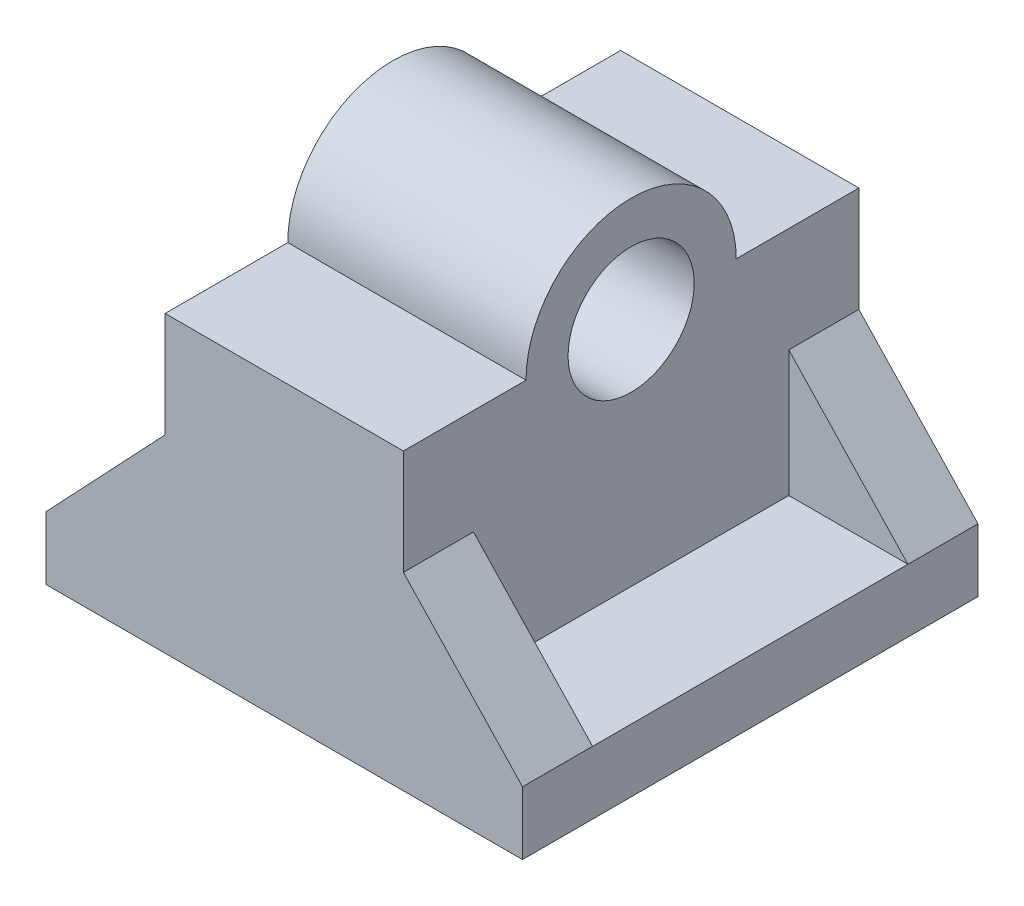
ISO-10303-21;
HEADER;
FILE_DESCRIPTION(('STEP AP214'),'2;1');
FILE_NAME('part.step','',(''),(''),'','','');
FILE_SCHEMA(('AUTOMOTIVE_DESIGN { 1 0 10303 214 1 1 1 1 }'));
ENDSEC;
DATA;
#1=APPLICATION_CONTEXT('core data for automotive mechanical design processes');
#2=APPLICATION_PROTOCOL_DEFINITION('international standard','automotive_design',2000,#1);
#3=PRODUCT_CONTEXT('',#1,'mechanical');
#4=PRODUCT('Part','Part','',(#3));
#5=PRODUCT_RELATED_PRODUCT_CATEGORY('part','',(#4));
#6=PRODUCT_DEFINITION_FORMATION('','',#4);
#7=PRODUCT_DEFINITION_CONTEXT('part definition',#1,'design');
#8=PRODUCT_DEFINITION('design','',#6,#7);
#9=PRODUCT_DEFINITION_SHAPE('','',#8);
#10=(LENGTH_UNIT() NAMED_UNIT(*) SI_UNIT(.MILLI.,.METRE.));
#11=(NAMED_UNIT(*) PLANE_ANGLE_UNIT() SI_UNIT($,.RADIAN.));
#12=(NAMED_UNIT(*) SI_UNIT($,.STERADIAN.) SOLID_ANGLE_UNIT());
#13=UNCERTAINTY_MEASURE_WITH_UNIT(LENGTH_MEASURE(1.E-05),#10,'distance_accuracy_value','');
#14=(GEOMETRIC_REPRESENTATION_CONTEXT(3) GLOBAL_UNCERTAINTY_ASSIGNED_CONTEXT((#13)) GLOBAL_UNIT_ASSIGNED_CONTEXT((#10,
#11,#12)) REPRESENTATION_CONTEXT('',''));
#15=CARTESIAN_POINT('',(0.,0.,0.));
#16=DIRECTION('',(0.,0.,1.));
#17=DIRECTION('',(1.,0.,0.));
#18=AXIS2_PLACEMENT_3D('',#15,#16,#17);
#19=CARTESIAN_POINT('',(34.,9.00000000000001,-65.));
#20=DIRECTION('',(0.727013152549817,0.686623532963716,0.));
#21=DIRECTION('',(-0.686623532963717,0.727013152549817,0.));
#22=AXIS2_PLACEMENT_3D('',#19,#20,#21);
#23=PLANE('',#22);
#24=DIRECTION('',(0.686623532963717,-0.727013152549817,0.));
#25=VECTOR('',#24,1.);
#26=CARTESIAN_POINT('',(34.,9.00000000000001,-10.));
#27=LINE('',#26,#25);
#28=CARTESIAN_POINT('',(17.,27.,-10.));
#29=VERTEX_POINT('',#28);
#30=CARTESIAN_POINT('',(34.,9.00000000000001,-10.));
#31=VERTEX_POINT('',#30);
#32=EDGE_CURVE('E11',#29,#31,#27,.T.);
#33=ORIENTED_EDGE('',*,*,#32,.F.);
#34=DIRECTION('',(0.,0.,1.));
#35=VECTOR('',#34,1.);
#36=CARTESIAN_POINT('',(17.,27.,-65.));
#37=LINE('',#36,#35);
#38=CARTESIAN_POINT('',(17.,27.,0.));
#39=VERTEX_POINT('',#38);
#40=EDGE_CURVE('E174',#29,#39,#37,.T.);
#41=ORIENTED_EDGE('',*,*,#40,.T.);
#42=DIRECTION('',(-0.686623532963716,0.727013152549817,0.));
#43=VECTOR('',#42,1.);
#44=CARTESIAN_POINT('',(34.,9.00000000000001,0.));
#45=LINE('',#44,#43);
#46=CARTESIAN_POINT('',(34.,9.00000000000001,0.));
#47=VERTEX_POINT('',#46);
#48=EDGE_CURVE('E244',#47,#39,#45,.T.);
#49=ORIENTED_EDGE('',*,*,#48,.F.);
#50=DIRECTION('',(0.,0.,1.));
#51=VECTOR('',#50,1.);
#52=CARTESIAN_POINT('',(34.,9.00000000000001,-65.));
#53=LINE('',#52,#51);
#54=EDGE_CURVE('E284',#31,#47,#53,.T.);
#55=ORIENTED_EDGE('',*,*,#54,.F.);
#56=EDGE_LOOP('',(#33,#41,#49,#55));
#57=FACE_BOUND('',#56,.T.);
#58=ADVANCED_FACE('F43',(#57),#23,.T.);
#59=CARTESIAN_POINT('',(-34.,9.00000000000001,-65.));
#60=DIRECTION('',(-0.727013152549817,0.686623532963716,0.));
#61=DIRECTION('',(-0.686623532963717,-0.727013152549817,0.));
#62=AXIS2_PLACEMENT_3D('',#59,#60,#61);
#63=PLANE('',#62);
#64=DIRECTION('',(0.,0.,1.));
#65=VECTOR('',#64,1.);
#66=CARTESIAN_POINT('',(-34.,9.00000000000001,-65.));
#67=LINE('',#66,#65);
#68=CARTESIAN_POINT('',(-34.,9.00000000000001,-65.));
#69=VERTEX_POINT('',#68);
#70=CARTESIAN_POINT('',(-34.,9.00000000000001,-55.));
#71=VERTEX_POINT('',#70);
#72=EDGE_CURVE('E264',#69,#71,#67,.T.);
#73=ORIENTED_EDGE('',*,*,#72,.T.);
#74=DIRECTION('',(0.686623532963717,0.727013152549817,0.));
#75=VECTOR('',#74,1.);
#76=CARTESIAN_POINT('',(-34.,9.00000000000001,-55.));
#77=LINE('',#76,#75);
#78=CARTESIAN_POINT('',(-17.,27.,-55.));
#79=VERTEX_POINT('',#78);
#80=EDGE_CURVE('E288',#71,#79,#77,.T.);
#81=ORIENTED_EDGE('',*,*,#80,.T.);
#82=DIRECTION('',(0.,0.,1.));
#83=VECTOR('',#82,1.);
#84=CARTESIAN_POINT('',(-17.,27.,-65.));
#85=LINE('',#84,#83);
#86=CARTESIAN_POINT('',(-17.,27.,-65.));
#87=VERTEX_POINT('',#86);
#88=EDGE_CURVE('E268',#87,#79,#85,.T.);
#89=ORIENTED_EDGE('',*,*,#88,.F.);
#90=DIRECTION('',(-0.686623532963716,-0.727013152549817,0.));
#91=VECTOR('',#90,1.);
#92=CARTESIAN_POINT('',(-34.,9.00000000000001,-65.));
#93=LINE('',#92,#91);
#94=EDGE_CURVE('E232',#87,#69,#93,.T.);
#95=ORIENTED_EDGE('',*,*,#94,.T.);
#96=EDGE_LOOP('',(#73,#81,#89,#95));
#97=FACE_BOUND('',#96,.T.);
#98=ADVANCED_FACE('F316',(#97),#63,.T.);
#99=CARTESIAN_POINT('',(-17.,27.,-10.));
#100=VERTEX_POINT('',#99);
#101=CARTESIAN_POINT('',(-17.,27.,0.));
#102=VERTEX_POINT('',#101);
#103=EDGE_CURVE('E271',#100,#102,#85,.T.);
#104=ORIENTED_EDGE('',*,*,#103,.F.);
#105=DIRECTION('',(-0.686623532963717,-0.727013152549817,0.));
#106=VECTOR('',#105,1.);
#107=CARTESIAN_POINT('',(-34.,9.00000000000001,-10.));
#108=LINE('',#107,#106);
#109=CARTESIAN_POINT('',(-34.,9.00000000000001,-10.));
#110=VERTEX_POINT('',#109);
#111=EDGE_CURVE('E263',#100,#110,#108,.T.);
#112=ORIENTED_EDGE('',*,*,#111,.T.);
#113=CARTESIAN_POINT('',(-34.,9.00000000000001,0.));
#114=VERTEX_POINT('',#113);
#115=EDGE_CURVE('E267',#110,#114,#67,.T.);
#116=ORIENTED_EDGE('',*,*,#115,.T.);
#117=DIRECTION('',(-0.686623532963716,-0.727013152549817,0.));
#118=VECTOR('',#117,1.);
#119=CARTESIAN_POINT('',(-34.,9.00000000000001,0.));
#120=LINE('',#119,#118);
#121=EDGE_CURVE('E256',#102,#114,#120,.T.);
#122=ORIENTED_EDGE('',*,*,#121,.F.);
#123=EDGE_LOOP('',(#104,#112,#116,#122));
#124=FACE_BOUND('',#123,.T.);
#125=ADVANCED_FACE('F339',(#124),#63,.T.);
#126=CARTESIAN_POINT('',(-17.,42.,-65.));
#127=DIRECTION('',(0.,1.,0.));
#128=DIRECTION('',(0.,0.,1.));
#129=AXIS2_PLACEMENT_3D('',#126,#127,#128);
#130=PLANE('',#129);
#131=DIRECTION('',(-1.,0.,0.));
#132=VECTOR('',#131,1.);
#133=CARTESIAN_POINT('',(17.,42.,-47.5));
#134=LINE('',#133,#132);
#135=CARTESIAN_POINT('',(17.,42.,-47.5));
#136=VERTEX_POINT('',#135);
#137=CARTESIAN_POINT('',(-17.,42.,-47.5));
#138=VERTEX_POINT('',#137);
#139=EDGE_CURVE('E209',#136,#138,#134,.T.);
#140=ORIENTED_EDGE('',*,*,#139,.F.);
#141=DIRECTION('',(0.,0.,1.));
#142=VECTOR('',#141,1.);
#143=CARTESIAN_POINT('',(17.,42.,-65.));
#144=LINE('',#143,#142);
#145=CARTESIAN_POINT('',(17.,42.,-65.));
#146=VERTEX_POINT('',#145);
#147=EDGE_CURVE('E275',#146,#136,#144,.T.);
#148=ORIENTED_EDGE('',*,*,#147,.F.);
#149=DIRECTION('',(-1.,0.,0.));
#150=VECTOR('',#149,1.);
#151=CARTESIAN_POINT('',(-17.,42.,-65.));
#152=LINE('',#151,#150);
#153=CARTESIAN_POINT('',(-17.,42.,-65.));
#154=VERTEX_POINT('',#153);
#155=EDGE_CURVE('E226',#146,#154,#152,.T.);
#156=ORIENTED_EDGE('',*,*,#155,.T.);
#157=DIRECTION('',(0.,0.,1.));
#158=VECTOR('',#157,1.);
#159=CARTESIAN_POINT('',(-17.,42.,-65.));
#160=LINE('',#159,#158);
#161=EDGE_CURVE('E272',#154,#138,#160,.T.);
#162=ORIENTED_EDGE('',*,*,#161,.T.);
#163=EDGE_LOOP('',(#140,#148,#156,#162));
#164=FACE_BOUND('',#163,.T.);
#165=ADVANCED_FACE('F321',(#164),#130,.T.);
#166=CARTESIAN_POINT('',(-34.,0.,-65.));
#167=DIRECTION('',(0.,-1.,0.));
#168=DIRECTION('',(0.,0.,-1.));
#169=AXIS2_PLACEMENT_3D('',#166,#167,#168);
#170=PLANE('',#169);
#171=DIRECTION('',(1.,0.,0.));
#172=VECTOR('',#171,1.);
#173=CARTESIAN_POINT('',(-34.,0.,0.));
#174=LINE('',#173,#172);
#175=CARTESIAN_POINT('',(-34.,0.,0.));
#176=VERTEX_POINT('',#175);
#177=CARTESIAN_POINT('',(34.,0.,0.));
#178=VERTEX_POINT('',#177);
#179=EDGE_CURVE('E212',#176,#178,#174,.T.);
#180=ORIENTED_EDGE('',*,*,#179,.F.);
#181=DIRECTION('',(0.,0.,1.));
#182=VECTOR('',#181,1.);
#183=CARTESIAN_POINT('',(-34.,0.,-65.));
#184=LINE('',#183,#182);
#185=CARTESIAN_POINT('',(-34.,0.,-65.));
#186=VERTEX_POINT('',#185);
#187=EDGE_CURVE('E261',#186,#176,#184,.T.);
#188=ORIENTED_EDGE('',*,*,#187,.F.);
#189=DIRECTION('',(1.,0.,0.));
#190=VECTOR('',#189,1.);
#191=CARTESIAN_POINT('',(-34.,0.,-65.));
#192=LINE('',#191,#190);
#193=CARTESIAN_POINT('',(34.,0.,-65.));
#194=VERTEX_POINT('',#193);
#195=EDGE_CURVE('E213',#186,#194,#192,.T.);
#196=ORIENTED_EDGE('',*,*,#195,.T.);
#197=DIRECTION('',(0.,0.,1.));
#198=VECTOR('',#197,1.);
#199=CARTESIAN_POINT('',(34.,0.,-65.));
#200=LINE('',#199,#198);
#201=EDGE_CURVE('E238',#194,#178,#200,.T.);
#202=ORIENTED_EDGE('',*,*,#201,.T.);
#203=EDGE_LOOP('',(#180,#188,#196,#202));
#204=FACE_BOUND('',#203,.T.);
#205=ADVANCED_FACE('F45',(#204),#170,.T.);
#206=CARTESIAN_POINT('',(-34.,0.,-65.));
#207=DIRECTION('',(-1.,0.,0.));
#208=DIRECTION('',(0.,0.,1.));
#209=AXIS2_PLACEMENT_3D('',#206,#207,#208);
#210=PLANE('',#209);
#211=DIRECTION('',(0.,-1.,0.));
#212=VECTOR('',#211,1.);
#213=CARTESIAN_POINT('',(-34.,0.,0.));
#214=LINE('',#213,#212);
#215=EDGE_CURVE('E217',#114,#176,#214,.T.);
#216=ORIENTED_EDGE('',*,*,#215,.F.);
#217=ORIENTED_EDGE('',*,*,#115,.F.);
#218=DIRECTION('',(0.,0.,-1.));
#219=VECTOR('',#218,1.);
#220=CARTESIAN_POINT('',(-34.,9.00000000000001,-55.));
#221=LINE('',#220,#219);
#222=EDGE_CURVE('E159',#110,#71,#221,.T.);
#223=ORIENTED_EDGE('',*,*,#222,.T.);
#224=ORIENTED_EDGE('',*,*,#72,.F.);
#225=DIRECTION('',(0.,-1.,0.));
#226=VECTOR('',#225,1.);
#227=CARTESIAN_POINT('',(-34.,0.,-65.));
#228=LINE('',#227,#226);
#229=EDGE_CURVE('E235',#69,#186,#228,.T.);
#230=ORIENTED_EDGE('',*,*,#229,.T.);
#231=ORIENTED_EDGE('',*,*,#187,.T.);
#232=EDGE_LOOP('',(#216,#217,#223,#224,#230,#231));
#233=FACE_BOUND('',#232,.T.);
#234=ADVANCED_FACE('F312',(#233),#210,.T.);
#235=CARTESIAN_POINT('',(-17.,27.,-65.));
#236=DIRECTION('',(-1.,0.,0.));
#237=DIRECTION('',(0.,0.,1.));
#238=AXIS2_PLACEMENT_3D('',#235,#236,#237);
#239=PLANE('',#238);
#240=CARTESIAN_POINT('',(-17.,42.,-32.5));
#241=DIRECTION('',(-1.,0.,0.));
#242=DIRECTION('',(0.,0.,1.));
#243=AXIS2_PLACEMENT_3D('',#240,#241,#242);
#244=CIRCLE('',#243,9.);
#245=CARTESIAN_POINT('',(-17.,42.,-23.5));
#246=VERTEX_POINT('',#245);
#247=EDGE_CURVE('E194',#246,#246,#244,.T.);
#248=ORIENTED_EDGE('',*,*,#247,.F.);
#249=EDGE_LOOP('',(#248));
#250=FACE_BOUND('',#249,.T.);
#251=CARTESIAN_POINT('',(-17.,42.,-17.5));
#252=VERTEX_POINT('',#251);
#253=CARTESIAN_POINT('',(-17.,42.,0.));
#254=VERTEX_POINT('',#253);
#255=EDGE_CURVE('E274',#252,#254,#160,.T.);
#256=ORIENTED_EDGE('',*,*,#255,.F.);
#257=CARTESIAN_POINT('',(-17.,42.,-32.5));
#258=DIRECTION('',(-1.,0.,0.));
#259=DIRECTION('',(0.,0.,1.));
#260=AXIS2_PLACEMENT_3D('',#257,#258,#259);
#261=CIRCLE('',#260,15.);
#262=EDGE_CURVE('E198',#252,#138,#261,.T.);
#263=ORIENTED_EDGE('',*,*,#262,.T.);
#264=ORIENTED_EDGE('',*,*,#161,.F.);
#265=DIRECTION('',(0.,-1.,0.));
#266=VECTOR('',#265,1.);
#267=CARTESIAN_POINT('',(-17.,27.,-65.));
#268=LINE('',#267,#266);
#269=EDGE_CURVE('E229',#154,#87,#268,.T.);
#270=ORIENTED_EDGE('',*,*,#269,.T.);
#271=ORIENTED_EDGE('',*,*,#88,.T.);
#272=DIRECTION('',(0.,1.,0.));
#273=VECTOR('',#272,1.);
#274=CARTESIAN_POINT('',(-17.,27.,-55.));
#275=LINE('',#274,#273);
#276=CARTESIAN_POINT('',(-17.,9.00000000000001,-55.));
#277=VERTEX_POINT('',#276);
#278=EDGE_CURVE('E184',#277,#79,#275,.T.);
#279=ORIENTED_EDGE('',*,*,#278,.F.);
#280=DIRECTION('',(0.,0.,-1.));
#281=VECTOR('',#280,1.);
#282=CARTESIAN_POINT('',(-17.,9.00000000000001,-55.));
#283=LINE('',#282,#281);
#284=CARTESIAN_POINT('',(-17.,9.00000000000001,-10.));
#285=VERTEX_POINT('',#284);
#286=EDGE_CURVE('E181',#285,#277,#283,.T.);
#287=ORIENTED_EDGE('',*,*,#286,.F.);
#288=DIRECTION('',(0.,-1.,0.));
#289=VECTOR('',#288,1.);
#290=CARTESIAN_POINT('',(-17.,9.00000000000001,-10.));
#291=LINE('',#290,#289);
#292=EDGE_CURVE('E65',#100,#285,#291,.T.);
#293=ORIENTED_EDGE('',*,*,#292,.F.);
#294=ORIENTED_EDGE('',*,*,#103,.T.);
#295=DIRECTION('',(0.,-1.,0.));
#296=VECTOR('',#295,1.);
#297=CARTESIAN_POINT('',(-17.,27.,0.));
#298=LINE('',#297,#296);
#299=EDGE_CURVE('E253',#254,#102,#298,.T.);
#300=ORIENTED_EDGE('',*,*,#299,.F.);
#301=EDGE_LOOP('',(#256,#263,#264,#270,#271,#279,#287,#293,#294,#300));
#302=FACE_BOUND('',#301,.T.);
#303=ADVANCED_FACE('F318',(#250,#302),#239,.T.);
#304=DIRECTION('',(-1.,0.,0.));
#305=VECTOR('',#304,1.);
#306=CARTESIAN_POINT('',(17.,42.,-17.5));
#307=LINE('',#306,#305);
#308=CARTESIAN_POINT('',(17.,42.,-17.5));
#309=VERTEX_POINT('',#308);
#310=EDGE_CURVE('E204',#252,#309,#307,.F.);
#311=ORIENTED_EDGE('',*,*,#310,.F.);
#312=ORIENTED_EDGE('',*,*,#255,.T.);
#313=DIRECTION('',(-1.,0.,0.));
#314=VECTOR('',#313,1.);
#315=CARTESIAN_POINT('',(-17.,42.,0.));
#316=LINE('',#315,#314);
#317=CARTESIAN_POINT('',(17.,42.,0.));
#318=VERTEX_POINT('',#317);
#319=EDGE_CURVE('E250',#318,#254,#316,.T.);
#320=ORIENTED_EDGE('',*,*,#319,.F.);
#321=EDGE_CURVE('E277',#309,#318,#144,.T.);
#322=ORIENTED_EDGE('',*,*,#321,.F.);
#323=EDGE_LOOP('',(#311,#312,#320,#322));
#324=FACE_BOUND('',#323,.T.);
#325=ADVANCED_FACE('F328',(#324),#130,.T.);
#326=CARTESIAN_POINT('',(17.,27.,-65.));
#327=DIRECTION('',(1.,0.,0.));
#328=DIRECTION('',(0.,0.,-1.));
#329=AXIS2_PLACEMENT_3D('',#326,#327,#328);
#330=PLANE('',#329);
#331=CARTESIAN_POINT('',(17.,42.,-32.5));
#332=DIRECTION('',(-1.,0.,0.));
#333=DIRECTION('',(0.,0.,1.));
#334=AXIS2_PLACEMENT_3D('',#331,#332,#333);
#335=CIRCLE('',#334,9.);
#336=CARTESIAN_POINT('',(17.,42.,-23.5));
#337=VERTEX_POINT('',#336);
#338=EDGE_CURVE('E195',#337,#337,#335,.T.);
#339=ORIENTED_EDGE('',*,*,#338,.T.);
#340=EDGE_LOOP('',(#339));
#341=FACE_BOUND('',#340,.T.);
#342=ORIENTED_EDGE('',*,*,#147,.T.);
#343=CARTESIAN_POINT('',(17.,42.,-32.5));
#344=DIRECTION('',(-1.,0.,0.));
#345=DIRECTION('',(0.,0.,1.));
#346=AXIS2_PLACEMENT_3D('',#343,#344,#345);
#347=CIRCLE('',#346,15.);
#348=EDGE_CURVE('E201',#309,#136,#347,.T.);
#349=ORIENTED_EDGE('',*,*,#348,.F.);
#350=ORIENTED_EDGE('',*,*,#321,.T.);
#351=DIRECTION('',(0.,1.,0.));
#352=VECTOR('',#351,1.);
#353=CARTESIAN_POINT('',(17.,27.,0.));
#354=LINE('',#353,#352);
#355=EDGE_CURVE('E247',#39,#318,#354,.T.);
#356=ORIENTED_EDGE('',*,*,#355,.F.);
#357=ORIENTED_EDGE('',*,*,#40,.F.);
#358=DIRECTION('',(0.,-1.,0.));
#359=VECTOR('',#358,1.);
#360=CARTESIAN_POINT('',(17.,9.00000000000001,-10.));
#361=LINE('',#360,#359);
#362=CARTESIAN_POINT('',(17.,9.00000000000001,-10.));
#363=VERTEX_POINT('',#362);
#364=EDGE_CURVE('E156',#29,#363,#361,.T.);
#365=ORIENTED_EDGE('',*,*,#364,.T.);
#366=DIRECTION('',(0.,0.,-1.));
#367=VECTOR('',#366,1.);
#368=CARTESIAN_POINT('',(17.,9.00000000000001,-55.));
#369=LINE('',#368,#367);
#370=CARTESIAN_POINT('',(17.,9.00000000000001,-55.));
#371=VERTEX_POINT('',#370);
#372=EDGE_CURVE('E163',#363,#371,#369,.T.);
#373=ORIENTED_EDGE('',*,*,#372,.T.);
#374=DIRECTION('',(0.,1.,0.));
#375=VECTOR('',#374,1.);
#376=CARTESIAN_POINT('',(17.,27.,-55.));
#377=LINE('',#376,#375);
#378=CARTESIAN_POINT('',(17.,27.,-55.));
#379=VERTEX_POINT('',#378);
#380=EDGE_CURVE('E175',#371,#379,#377,.T.);
#381=ORIENTED_EDGE('',*,*,#380,.T.);
#382=CARTESIAN_POINT('',(17.,27.,-65.));
#383=VERTEX_POINT('',#382);
#384=EDGE_CURVE('E278',#383,#379,#37,.T.);
#385=ORIENTED_EDGE('',*,*,#384,.F.);
#386=DIRECTION('',(0.,1.,0.));
#387=VECTOR('',#386,1.);
#388=CARTESIAN_POINT('',(17.,27.,-65.));
#389=LINE('',#388,#387);
#390=EDGE_CURVE('E223',#383,#146,#389,.T.);
#391=ORIENTED_EDGE('',*,*,#390,.T.);
#392=EDGE_LOOP('',(#342,#349,#350,#356,#357,#365,#373,#381,#385,#391));
#393=FACE_BOUND('',#392,.T.);
#394=ADVANCED_FACE('F172',(#341,#393),#330,.T.);
#395=DIRECTION('',(-0.686623532963717,0.727013152549817,0.));
#396=VECTOR('',#395,1.);
#397=CARTESIAN_POINT('',(34.,9.00000000000001,-55.));
#398=LINE('',#397,#396);
#399=CARTESIAN_POINT('',(34.,9.00000000000001,-55.));
#400=VERTEX_POINT('',#399);
#401=EDGE_CURVE('E51',#400,#379,#398,.T.);
#402=ORIENTED_EDGE('',*,*,#401,.F.);
#403=CARTESIAN_POINT('',(34.,9.00000000000001,-65.));
#404=VERTEX_POINT('',#403);
#405=EDGE_CURVE('E281',#404,#400,#53,.T.);
#406=ORIENTED_EDGE('',*,*,#405,.F.);
#407=DIRECTION('',(-0.686623532963716,0.727013152549817,0.));
#408=VECTOR('',#407,1.);
#409=CARTESIAN_POINT('',(34.,9.00000000000001,-65.));
#410=LINE('',#409,#408);
#411=EDGE_CURVE('E220',#404,#383,#410,.T.);
#412=ORIENTED_EDGE('',*,*,#411,.T.);
#413=ORIENTED_EDGE('',*,*,#384,.T.);
#414=EDGE_LOOP('',(#402,#406,#412,#413));
#415=FACE_BOUND('',#414,.T.);
#416=ADVANCED_FACE('F295',(#415),#23,.T.);
#417=CARTESIAN_POINT('',(34.,0.,-65.));
#418=DIRECTION('',(1.,0.,0.));
#419=DIRECTION('',(0.,0.,-1.));
#420=AXIS2_PLACEMENT_3D('',#417,#418,#419);
#421=PLANE('',#420);
#422=DIRECTION('',(0.,1.,0.));
#423=VECTOR('',#422,1.);
#424=CARTESIAN_POINT('',(34.,0.,0.));
#425=LINE('',#424,#423);
#426=EDGE_CURVE('E241',#178,#47,#425,.T.);
#427=ORIENTED_EDGE('',*,*,#426,.F.);
#428=ORIENTED_EDGE('',*,*,#201,.F.);
#429=DIRECTION('',(0.,1.,0.));
#430=VECTOR('',#429,1.);
#431=CARTESIAN_POINT('',(34.,0.,-65.));
#432=LINE('',#431,#430);
#433=EDGE_CURVE('E216',#194,#404,#432,.T.);
#434=ORIENTED_EDGE('',*,*,#433,.T.);
#435=ORIENTED_EDGE('',*,*,#405,.T.);
#436=DIRECTION('',(0.,0.,-1.));
#437=VECTOR('',#436,1.);
#438=CARTESIAN_POINT('',(34.,9.00000000000001,-55.));
#439=LINE('',#438,#437);
#440=EDGE_CURVE('E168',#31,#400,#439,.T.);
#441=ORIENTED_EDGE('',*,*,#440,.F.);
#442=ORIENTED_EDGE('',*,*,#54,.T.);
#443=EDGE_LOOP('',(#427,#428,#434,#435,#441,#442));
#444=FACE_BOUND('',#443,.T.);
#445=ADVANCED_FACE('F304',(#444),#421,.T.);
#446=CARTESIAN_POINT('',(0.,0.,-65.));
#447=DIRECTION('',(0.,0.,1.));
#448=DIRECTION('',(1.,0.,0.));
#449=AXIS2_PLACEMENT_3D('',#446,#447,#448);
#450=PLANE('',#449);
#451=ORIENTED_EDGE('',*,*,#195,.F.);
#452=ORIENTED_EDGE('',*,*,#229,.F.);
#453=ORIENTED_EDGE('',*,*,#94,.F.);
#454=ORIENTED_EDGE('',*,*,#269,.F.);
#455=ORIENTED_EDGE('',*,*,#155,.F.);
#456=ORIENTED_EDGE('',*,*,#390,.F.);
#457=ORIENTED_EDGE('',*,*,#411,.F.);
#458=ORIENTED_EDGE('',*,*,#433,.F.);
#459=EDGE_LOOP('',(#451,#452,#453,#454,#455,#456,#457,#458));
#460=FACE_BOUND('',#459,.T.);
#461=ADVANCED_FACE('F300',(#460),#450,.F.);
#462=CARTESIAN_POINT('',(0.,0.,0.));
#463=DIRECTION('',(0.,0.,1.));
#464=DIRECTION('',(1.,0.,0.));
#465=AXIS2_PLACEMENT_3D('',#462,#463,#464);
#466=PLANE('',#465);
#467=ORIENTED_EDGE('',*,*,#179,.T.);
#468=ORIENTED_EDGE('',*,*,#426,.T.);
#469=ORIENTED_EDGE('',*,*,#48,.T.);
#470=ORIENTED_EDGE('',*,*,#355,.T.);
#471=ORIENTED_EDGE('',*,*,#319,.T.);
#472=ORIENTED_EDGE('',*,*,#299,.T.);
#473=ORIENTED_EDGE('',*,*,#121,.T.);
#474=ORIENTED_EDGE('',*,*,#215,.T.);
#475=EDGE_LOOP('',(#467,#468,#469,#470,#471,#472,#473,#474));
#476=FACE_BOUND('',#475,.T.);
#477=ADVANCED_FACE('F331',(#476),#466,.T.);
#478=CARTESIAN_POINT('',(17.,42.,-32.5));
#479=DIRECTION('',(-1.,0.,0.));
#480=DIRECTION('',(0.,0.,1.));
#481=AXIS2_PLACEMENT_3D('',#478,#479,#480);
#482=CYLINDRICAL_SURFACE('',#481,15.);
#483=ORIENTED_EDGE('',*,*,#348,.T.);
#484=ORIENTED_EDGE('',*,*,#139,.T.);
#485=ORIENTED_EDGE('',*,*,#262,.F.);
#486=ORIENTED_EDGE('',*,*,#310,.T.);
#487=EDGE_LOOP('',(#483,#484,#485,#486));
#488=FACE_BOUND('',#487,.T.);
#489=ADVANCED_FACE('F323',(#488),#482,.T.);
#490=CARTESIAN_POINT('',(17.,42.,-32.5));
#491=DIRECTION('',(-1.,0.,0.));
#492=DIRECTION('',(0.,0.,1.));
#493=AXIS2_PLACEMENT_3D('',#490,#491,#492);
#494=CYLINDRICAL_SURFACE('',#493,9.);
#495=ORIENTED_EDGE('',*,*,#338,.F.);
#496=EDGE_LOOP('',(#495));
#497=FACE_BOUND('',#496,.T.);
#498=ORIENTED_EDGE('',*,*,#247,.T.);
#499=EDGE_LOOP('',(#498));
#500=FACE_BOUND('',#499,.T.);
#501=ADVANCED_FACE('F364',(#497,#500),#494,.F.);
#502=CARTESIAN_POINT('',(-17.,9.00000000000001,-55.));
#503=DIRECTION('',(0.,1.,0.));
#504=DIRECTION('',(0.,0.,1.));
#505=AXIS2_PLACEMENT_3D('',#502,#503,#504);
#506=PLANE('',#505);
#507=ORIENTED_EDGE('',*,*,#222,.F.);
#508=DIRECTION('',(-1.,0.,0.));
#509=VECTOR('',#508,1.);
#510=CARTESIAN_POINT('',(-17.,9.00000000000001,-10.));
#511=LINE('',#510,#509);
#512=EDGE_CURVE('E187',#285,#110,#511,.T.);
#513=ORIENTED_EDGE('',*,*,#512,.F.);
#514=ORIENTED_EDGE('',*,*,#286,.T.);
#515=DIRECTION('',(-1.,0.,0.));
#516=VECTOR('',#515,1.);
#517=CARTESIAN_POINT('',(-17.,9.00000000000001,-55.));
#518=LINE('',#517,#516);
#519=EDGE_CURVE('E191',#277,#71,#518,.T.);
#520=ORIENTED_EDGE('',*,*,#519,.T.);
#521=EDGE_LOOP('',(#507,#513,#514,#520));
#522=FACE_BOUND('',#521,.T.);
#523=ADVANCED_FACE('F367',(#522),#506,.T.);
#524=CARTESIAN_POINT('',(-17.,27.,-55.));
#525=DIRECTION('',(0.,0.,1.));
#526=DIRECTION('',(0.,-1.,0.));
#527=AXIS2_PLACEMENT_3D('',#524,#525,#526);
#528=PLANE('',#527);
#529=ORIENTED_EDGE('',*,*,#519,.F.);
#530=ORIENTED_EDGE('',*,*,#278,.T.);
#531=ORIENTED_EDGE('',*,*,#80,.F.);
#532=EDGE_LOOP('',(#529,#530,#531));
#533=FACE_BOUND('',#532,.T.);
#534=ADVANCED_FACE('F371',(#533),#528,.T.);
#535=CARTESIAN_POINT('',(-17.,9.00000000000001,-10.));
#536=DIRECTION('',(0.,0.,-1.));
#537=DIRECTION('',(0.,1.,0.));
#538=AXIS2_PLACEMENT_3D('',#535,#536,#537);
#539=PLANE('',#538);
#540=ORIENTED_EDGE('',*,*,#292,.T.);
#541=ORIENTED_EDGE('',*,*,#512,.T.);
#542=ORIENTED_EDGE('',*,*,#111,.F.);
#543=EDGE_LOOP('',(#540,#541,#542));
#544=FACE_BOUND('',#543,.T.);
#545=ADVANCED_FACE('F375',(#544),#539,.T.);
#546=CARTESIAN_POINT('',(17.,9.00000000000001,-55.));
#547=DIRECTION('',(0.,-1.,0.));
#548=DIRECTION('',(0.,0.,-1.));
#549=AXIS2_PLACEMENT_3D('',#546,#547,#548);
#550=PLANE('',#549);
#551=ORIENTED_EDGE('',*,*,#440,.T.);
#552=DIRECTION('',(1.,0.,0.));
#553=VECTOR('',#552,1.);
#554=CARTESIAN_POINT('',(17.,9.00000000000001,-55.));
#555=LINE('',#554,#553);
#556=EDGE_CURVE('E160',#371,#400,#555,.T.);
#557=ORIENTED_EDGE('',*,*,#556,.F.);
#558=ORIENTED_EDGE('',*,*,#372,.F.);
#559=DIRECTION('',(1.,0.,0.));
#560=VECTOR('',#559,1.);
#561=CARTESIAN_POINT('',(17.,9.00000000000001,-10.));
#562=LINE('',#561,#560);
#563=EDGE_CURVE('E58',#363,#31,#562,.T.);
#564=ORIENTED_EDGE('',*,*,#563,.T.);
#565=EDGE_LOOP('',(#551,#557,#558,#564));
#566=FACE_BOUND('',#565,.T.);
#567=ADVANCED_FACE('F164',(#566),#550,.F.);
#568=CARTESIAN_POINT('',(17.,9.00000000000001,-10.));
#569=DIRECTION('',(0.,0.,1.));
#570=DIRECTION('',(0.,-1.,0.));
#571=AXIS2_PLACEMENT_3D('',#568,#569,#570);
#572=PLANE('',#571);
#573=ORIENTED_EDGE('',*,*,#32,.T.);
#574=ORIENTED_EDGE('',*,*,#563,.F.);
#575=ORIENTED_EDGE('',*,*,#364,.F.);
#576=EDGE_LOOP('',(#573,#574,#575));
#577=FACE_BOUND('',#576,.T.);
#578=ADVANCED_FACE('F154',(#577),#572,.F.);
#579=CARTESIAN_POINT('',(17.,27.,-55.));
#580=DIRECTION('',(0.,0.,-1.));
#581=DIRECTION('',(0.,1.,0.));
#582=AXIS2_PLACEMENT_3D('',#579,#580,#581);
#583=PLANE('',#582);
#584=ORIENTED_EDGE('',*,*,#401,.T.);
#585=ORIENTED_EDGE('',*,*,#380,.F.);
#586=ORIENTED_EDGE('',*,*,#556,.T.);
#587=EDGE_LOOP('',(#584,#585,#586));
#588=FACE_BOUND('',#587,.T.);
#589=ADVANCED_FACE('F292',(#588),#583,.F.);
#590=CLOSED_SHELL('',(#58,#98,#125,#165,#205,#234,#303,#325,#394,#416,#445,#461,#477,#489,#501,
#523,#534,#545,#567,#578,#589));
#591=MANIFOLD_SOLID_BREP('B2',#590);
#592=ADVANCED_BREP_SHAPE_REPRESENTATION('',(#18,#591),#14);
#593=SHAPE_DEFINITION_REPRESENTATION(#9,#592);
ENDSEC;
END-ISO-10303-21;
